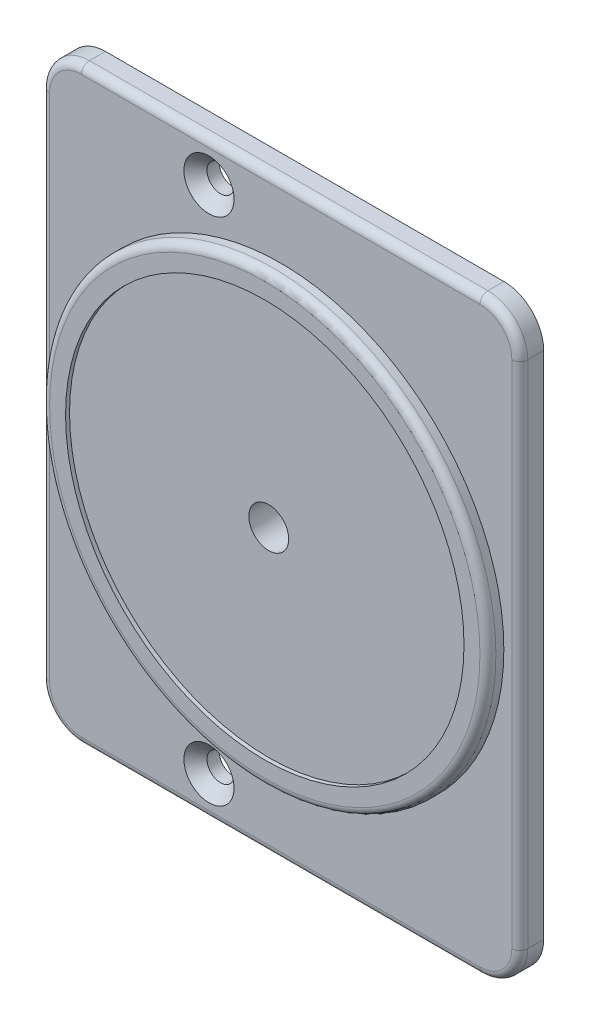
ISO-10303-21;
HEADER;
FILE_DESCRIPTION(('STEP AP214'),'2;1');
FILE_NAME('part.step','',(''),(''),'','','');
FILE_SCHEMA(('AUTOMOTIVE_DESIGN { 1 0 10303 214 1 1 1 1 }'));
ENDSEC;
DATA;
#1=APPLICATION_CONTEXT('core data for automotive mechanical design processes');
#2=APPLICATION_PROTOCOL_DEFINITION('international standard','automotive_design',2000,#1);
#3=PRODUCT_CONTEXT('',#1,'mechanical');
#4=PRODUCT('Part','Part','',(#3));
#5=PRODUCT_RELATED_PRODUCT_CATEGORY('part','',(#4));
#6=PRODUCT_DEFINITION_FORMATION('','',#4);
#7=PRODUCT_DEFINITION_CONTEXT('part definition',#1,'design');
#8=PRODUCT_DEFINITION('design','',#6,#7);
#9=PRODUCT_DEFINITION_SHAPE('','',#8);
#10=(LENGTH_UNIT() NAMED_UNIT(*) SI_UNIT(.MILLI.,.METRE.));
#11=(NAMED_UNIT(*) PLANE_ANGLE_UNIT() SI_UNIT($,.RADIAN.));
#12=(NAMED_UNIT(*) SI_UNIT($,.STERADIAN.) SOLID_ANGLE_UNIT());
#13=UNCERTAINTY_MEASURE_WITH_UNIT(LENGTH_MEASURE(1.E-05),#10,'distance_accuracy_value','');
#14=(GEOMETRIC_REPRESENTATION_CONTEXT(3) GLOBAL_UNCERTAINTY_ASSIGNED_CONTEXT((#13)) GLOBAL_UNIT_ASSIGNED_CONTEXT((#10,
#11,#12)) REPRESENTATION_CONTEXT('',''));
#15=CARTESIAN_POINT('',(0.,0.,0.));
#16=DIRECTION('',(0.,0.,1.));
#17=DIRECTION('',(1.,0.,0.));
#18=AXIS2_PLACEMENT_3D('',#15,#16,#17);
#19=CARTESIAN_POINT('',(0.,0.,0.));
#20=DIRECTION('',(0.,0.,1.));
#21=DIRECTION('',(1.,0.,0.));
#22=AXIS2_PLACEMENT_3D('',#19,#20,#21);
#23=PLANE('',#22);
#24=CARTESIAN_POINT('',(-9.,32.,0.));
#25=DIRECTION('',(0.,0.,1.));
#26=DIRECTION('',(1.,0.,0.));
#27=AXIS2_PLACEMENT_3D('',#24,#25,#26);
#28=CIRCLE('',#27,3.15);
#29=CARTESIAN_POINT('',(-5.85,32.,0.));
#30=VERTEX_POINT('',#29);
#31=EDGE_CURVE('E539',#30,#30,#28,.T.);
#32=ORIENTED_EDGE('',*,*,#31,.F.);
#33=EDGE_LOOP('',(#32));
#34=FACE_BOUND('',#33,.T.);
#35=CARTESIAN_POINT('',(-9.,-32.,0.));
#36=DIRECTION('',(0.,0.,1.));
#37=DIRECTION('',(1.,0.,0.));
#38=AXIS2_PLACEMENT_3D('',#35,#36,#37);
#39=CIRCLE('',#38,3.15);
#40=CARTESIAN_POINT('',(-5.85,-32.,0.));
#41=VERTEX_POINT('',#40);
#42=EDGE_CURVE('E546',#41,#41,#39,.T.);
#43=ORIENTED_EDGE('',*,*,#42,.F.);
#44=EDGE_LOOP('',(#43));
#45=FACE_BOUND('',#44,.T.);
#46=DIRECTION('',(0.,1.,0.));
#47=VECTOR('',#46,1.);
#48=CARTESIAN_POINT('',(29.,0.,0.));
#49=LINE('',#48,#47);
#50=CARTESIAN_POINT('',(29.,-32.,0.));
#51=VERTEX_POINT('',#50);
#52=CARTESIAN_POINT('',(29.,32.,0.));
#53=VERTEX_POINT('',#52);
#54=EDGE_CURVE('E181',#51,#53,#49,.T.);
#55=ORIENTED_EDGE('',*,*,#54,.T.);
#56=CARTESIAN_POINT('',(25.,32.,0.));
#57=DIRECTION('',(0.,0.,1.));
#58=DIRECTION('',(1.,0.,0.));
#59=AXIS2_PLACEMENT_3D('',#56,#57,#58);
#60=CIRCLE('',#59,4.);
#61=CARTESIAN_POINT('',(25.,36.,0.));
#62=VERTEX_POINT('',#61);
#63=EDGE_CURVE('E183',#53,#62,#60,.T.);
#64=ORIENTED_EDGE('',*,*,#63,.T.);
#65=DIRECTION('',(-1.,0.,0.));
#66=VECTOR('',#65,1.);
#67=CARTESIAN_POINT('',(0.,36.,0.));
#68=LINE('',#67,#66);
#69=CARTESIAN_POINT('',(-25.,36.,0.));
#70=VERTEX_POINT('',#69);
#71=EDGE_CURVE('E169',#62,#70,#68,.T.);
#72=ORIENTED_EDGE('',*,*,#71,.T.);
#73=CARTESIAN_POINT('',(-25.,32.,0.));
#74=DIRECTION('',(0.,0.,1.));
#75=DIRECTION('',(1.,0.,0.));
#76=AXIS2_PLACEMENT_3D('',#73,#74,#75);
#77=CIRCLE('',#76,4.);
#78=CARTESIAN_POINT('',(-29.,32.,0.));
#79=VERTEX_POINT('',#78);
#80=EDGE_CURVE('E171',#70,#79,#77,.T.);
#81=ORIENTED_EDGE('',*,*,#80,.T.);
#82=DIRECTION('',(0.,-1.,0.));
#83=VECTOR('',#82,1.);
#84=CARTESIAN_POINT('',(-29.,0.,0.));
#85=LINE('',#84,#83);
#86=CARTESIAN_POINT('',(-29.,-32.,0.));
#87=VERTEX_POINT('',#86);
#88=EDGE_CURVE('E173',#79,#87,#85,.T.);
#89=ORIENTED_EDGE('',*,*,#88,.T.);
#90=CARTESIAN_POINT('',(-25.,-32.,0.));
#91=DIRECTION('',(0.,0.,1.));
#92=DIRECTION('',(1.,0.,0.));
#93=AXIS2_PLACEMENT_3D('',#90,#91,#92);
#94=CIRCLE('',#93,4.);
#95=CARTESIAN_POINT('',(-25.,-36.,0.));
#96=VERTEX_POINT('',#95);
#97=EDGE_CURVE('E175',#87,#96,#94,.T.);
#98=ORIENTED_EDGE('',*,*,#97,.T.);
#99=DIRECTION('',(1.,0.,0.));
#100=VECTOR('',#99,1.);
#101=CARTESIAN_POINT('',(0.,-36.,0.));
#102=LINE('',#101,#100);
#103=CARTESIAN_POINT('',(25.,-36.,0.));
#104=VERTEX_POINT('',#103);
#105=EDGE_CURVE('E177',#96,#104,#102,.T.);
#106=ORIENTED_EDGE('',*,*,#105,.T.);
#107=CARTESIAN_POINT('',(25.,-32.,0.));
#108=DIRECTION('',(0.,0.,1.));
#109=DIRECTION('',(1.,0.,0.));
#110=AXIS2_PLACEMENT_3D('',#107,#108,#109);
#111=CIRCLE('',#110,4.);
#112=EDGE_CURVE('E179',#104,#51,#111,.T.);
#113=ORIENTED_EDGE('',*,*,#112,.T.);
#114=EDGE_LOOP('',(#55,#64,#72,#81,#89,#98,#106,#113));
#115=FACE_BOUND('',#114,.T.);
#116=CARTESIAN_POINT('',(0.,0.,0.));
#117=DIRECTION('',(0.,0.,1.));
#118=DIRECTION('',(1.,0.,0.));
#119=AXIS2_PLACEMENT_3D('',#116,#117,#118);
#120=CIRCLE('',#119,28.);
#121=CARTESIAN_POINT('',(28.,0.,0.));
#122=VERTEX_POINT('',#121);
#123=EDGE_CURVE('E233',#122,#122,#120,.T.);
#124=ORIENTED_EDGE('',*,*,#123,.F.);
#125=EDGE_LOOP('',(#124));
#126=FACE_BOUND('',#125,.T.);
#127=ADVANCED_FACE('F35',(#34,#45,#115,#126),#23,.T.);
#128=CARTESIAN_POINT('',(-30.,37.,-3.));
#129=DIRECTION('',(-1.,0.,0.));
#130=DIRECTION('',(0.,-1.,0.));
#131=AXIS2_PLACEMENT_3D('',#128,#129,#130);
#132=PLANE('',#131);
#133=DIRECTION('',(0.,0.,1.));
#134=VECTOR('',#133,1.);
#135=CARTESIAN_POINT('',(-30.,-32.,-3.));
#136=LINE('',#135,#134);
#137=CARTESIAN_POINT('',(-30.,-32.,-3.));
#138=VERTEX_POINT('',#137);
#139=CARTESIAN_POINT('',(-30.,-32.,-1.));
#140=VERTEX_POINT('',#139);
#141=EDGE_CURVE('E154',#138,#140,#136,.T.);
#142=ORIENTED_EDGE('',*,*,#141,.T.);
#143=DIRECTION('',(0.,-1.,0.));
#144=VECTOR('',#143,1.);
#145=CARTESIAN_POINT('',(-30.,37.,-1.));
#146=LINE('',#145,#144);
#147=CARTESIAN_POINT('',(-30.,32.,-1.));
#148=VERTEX_POINT('',#147);
#149=EDGE_CURVE('E60',#140,#148,#146,.F.);
#150=ORIENTED_EDGE('',*,*,#149,.T.);
#151=DIRECTION('',(0.,0.,1.));
#152=VECTOR('',#151,1.);
#153=CARTESIAN_POINT('',(-30.,32.,-3.));
#154=LINE('',#153,#152);
#155=CARTESIAN_POINT('',(-30.,32.,-3.));
#156=VERTEX_POINT('',#155);
#157=EDGE_CURVE('E157',#148,#156,#154,.F.);
#158=ORIENTED_EDGE('',*,*,#157,.T.);
#159=DIRECTION('',(0.,-1.,0.));
#160=VECTOR('',#159,1.);
#161=CARTESIAN_POINT('',(-30.,37.,-3.));
#162=LINE('',#161,#160);
#163=EDGE_CURVE('E150',#156,#138,#162,.T.);
#164=ORIENTED_EDGE('',*,*,#163,.T.);
#165=EDGE_LOOP('',(#142,#150,#158,#164));
#166=FACE_BOUND('',#165,.T.);
#167=ADVANCED_FACE('F272',(#166),#132,.T.);
#168=CARTESIAN_POINT('',(-30.,37.,-3.));
#169=DIRECTION('',(0.,1.,0.));
#170=DIRECTION('',(0.,0.,1.));
#171=AXIS2_PLACEMENT_3D('',#168,#169,#170);
#172=PLANE('',#171);
#173=DIRECTION('',(0.,0.,1.));
#174=VECTOR('',#173,1.);
#175=CARTESIAN_POINT('',(-25.,37.,-3.));
#176=LINE('',#175,#174);
#177=CARTESIAN_POINT('',(-25.,37.,-3.));
#178=VERTEX_POINT('',#177);
#179=CARTESIAN_POINT('',(-25.,37.,-1.));
#180=VERTEX_POINT('',#179);
#181=EDGE_CURVE('E165',#178,#180,#176,.T.);
#182=ORIENTED_EDGE('',*,*,#181,.T.);
#183=DIRECTION('',(-1.,0.,0.));
#184=VECTOR('',#183,1.);
#185=CARTESIAN_POINT('',(-30.,37.,-1.));
#186=LINE('',#185,#184);
#187=CARTESIAN_POINT('',(25.,37.,-1.));
#188=VERTEX_POINT('',#187);
#189=EDGE_CURVE('E11',#180,#188,#186,.F.);
#190=ORIENTED_EDGE('',*,*,#189,.T.);
#191=DIRECTION('',(0.,0.,1.));
#192=VECTOR('',#191,1.);
#193=CARTESIAN_POINT('',(25.,37.,-3.));
#194=LINE('',#193,#192);
#195=CARTESIAN_POINT('',(25.,37.,-3.));
#196=VERTEX_POINT('',#195);
#197=EDGE_CURVE('E167',#188,#196,#194,.F.);
#198=ORIENTED_EDGE('',*,*,#197,.T.);
#199=DIRECTION('',(-1.,0.,0.));
#200=VECTOR('',#199,1.);
#201=CARTESIAN_POINT('',(-30.,37.,-3.));
#202=LINE('',#201,#200);
#203=EDGE_CURVE('E139',#196,#178,#202,.T.);
#204=ORIENTED_EDGE('',*,*,#203,.T.);
#205=EDGE_LOOP('',(#182,#190,#198,#204));
#206=FACE_BOUND('',#205,.T.);
#207=ADVANCED_FACE('F253',(#206),#172,.T.);
#208=CARTESIAN_POINT('',(30.,37.,-3.));
#209=DIRECTION('',(1.,0.,0.));
#210=DIRECTION('',(0.,1.,0.));
#211=AXIS2_PLACEMENT_3D('',#208,#209,#210);
#212=PLANE('',#211);
#213=DIRECTION('',(0.,0.,1.));
#214=VECTOR('',#213,1.);
#215=CARTESIAN_POINT('',(30.,32.,-3.));
#216=LINE('',#215,#214);
#217=CARTESIAN_POINT('',(30.,32.,-3.));
#218=VERTEX_POINT('',#217);
#219=CARTESIAN_POINT('',(30.,32.,-1.));
#220=VERTEX_POINT('',#219);
#221=EDGE_CURVE('E245',#218,#220,#216,.T.);
#222=ORIENTED_EDGE('',*,*,#221,.T.);
#223=DIRECTION('',(0.,1.,0.));
#224=VECTOR('',#223,1.);
#225=CARTESIAN_POINT('',(30.,37.,-1.));
#226=LINE('',#225,#224);
#227=CARTESIAN_POINT('',(30.,-32.,-1.));
#228=VERTEX_POINT('',#227);
#229=EDGE_CURVE('E189',#220,#228,#226,.F.);
#230=ORIENTED_EDGE('',*,*,#229,.T.);
#231=DIRECTION('',(0.,0.,1.));
#232=VECTOR('',#231,1.);
#233=CARTESIAN_POINT('',(30.,-32.,-3.));
#234=LINE('',#233,#232);
#235=CARTESIAN_POINT('',(30.,-32.,-3.));
#236=VERTEX_POINT('',#235);
#237=EDGE_CURVE('E248',#228,#236,#234,.F.);
#238=ORIENTED_EDGE('',*,*,#237,.T.);
#239=DIRECTION('',(0.,1.,0.));
#240=VECTOR('',#239,1.);
#241=CARTESIAN_POINT('',(30.,37.,-3.));
#242=LINE('',#241,#240);
#243=EDGE_CURVE('E149',#236,#218,#242,.T.);
#244=ORIENTED_EDGE('',*,*,#243,.T.);
#245=EDGE_LOOP('',(#222,#230,#238,#244));
#246=FACE_BOUND('',#245,.T.);
#247=ADVANCED_FACE('F286',(#246),#212,.T.);
#248=CARTESIAN_POINT('',(-30.,-37.,-3.));
#249=DIRECTION('',(0.,-1.,0.));
#250=DIRECTION('',(0.,0.,-1.));
#251=AXIS2_PLACEMENT_3D('',#248,#249,#250);
#252=PLANE('',#251);
#253=DIRECTION('',(0.,0.,1.));
#254=VECTOR('',#253,1.);
#255=CARTESIAN_POINT('',(25.,-37.,-3.));
#256=LINE('',#255,#254);
#257=CARTESIAN_POINT('',(25.,-37.,-3.));
#258=VERTEX_POINT('',#257);
#259=CARTESIAN_POINT('',(25.,-37.,-1.));
#260=VERTEX_POINT('',#259);
#261=EDGE_CURVE('E138',#258,#260,#256,.T.);
#262=ORIENTED_EDGE('',*,*,#261,.T.);
#263=DIRECTION('',(1.,0.,0.));
#264=VECTOR('',#263,1.);
#265=CARTESIAN_POINT('',(-30.,-37.,-1.));
#266=LINE('',#265,#264);
#267=CARTESIAN_POINT('',(-25.,-37.,-1.));
#268=VERTEX_POINT('',#267);
#269=EDGE_CURVE('E134',#260,#268,#266,.F.);
#270=ORIENTED_EDGE('',*,*,#269,.T.);
#271=DIRECTION('',(0.,0.,1.));
#272=VECTOR('',#271,1.);
#273=CARTESIAN_POINT('',(-25.,-37.,-3.));
#274=LINE('',#273,#272);
#275=CARTESIAN_POINT('',(-25.,-37.,-3.));
#276=VERTEX_POINT('',#275);
#277=EDGE_CURVE('E127',#268,#276,#274,.F.);
#278=ORIENTED_EDGE('',*,*,#277,.T.);
#279=DIRECTION('',(1.,0.,0.));
#280=VECTOR('',#279,1.);
#281=CARTESIAN_POINT('',(-30.,-37.,-3.));
#282=LINE('',#281,#280);
#283=EDGE_CURVE('E131',#276,#258,#282,.T.);
#284=ORIENTED_EDGE('',*,*,#283,.T.);
#285=EDGE_LOOP('',(#262,#270,#278,#284));
#286=FACE_BOUND('',#285,.T.);
#287=ADVANCED_FACE('F130',(#286),#252,.T.);
#288=CARTESIAN_POINT('',(0.,0.,-3.));
#289=DIRECTION('',(0.,0.,1.));
#290=DIRECTION('',(1.,0.,0.));
#291=AXIS2_PLACEMENT_3D('',#288,#289,#290);
#292=PLANE('',#291);
#293=CARTESIAN_POINT('',(-9.,32.,-3.));
#294=DIRECTION('',(0.,0.,1.));
#295=DIRECTION('',(1.,0.,0.));
#296=AXIS2_PLACEMENT_3D('',#293,#294,#295);
#297=CIRCLE('',#296,1.7);
#298=CARTESIAN_POINT('',(-7.3,32.,-3.));
#299=VERTEX_POINT('',#298);
#300=EDGE_CURVE('E541',#299,#299,#297,.T.);
#301=ORIENTED_EDGE('',*,*,#300,.T.);
#302=EDGE_LOOP('',(#301));
#303=FACE_BOUND('',#302,.T.);
#304=CARTESIAN_POINT('',(-9.,-32.,-3.));
#305=DIRECTION('',(0.,0.,1.));
#306=DIRECTION('',(1.,0.,0.));
#307=AXIS2_PLACEMENT_3D('',#304,#305,#306);
#308=CIRCLE('',#307,1.7);
#309=CARTESIAN_POINT('',(-7.3,-32.,-3.));
#310=VERTEX_POINT('',#309);
#311=EDGE_CURVE('E552',#310,#310,#308,.T.);
#312=ORIENTED_EDGE('',*,*,#311,.T.);
#313=EDGE_LOOP('',(#312));
#314=FACE_BOUND('',#313,.T.);
#315=CARTESIAN_POINT('',(0.,0.,-3.));
#316=DIRECTION('',(0.,0.,-1.));
#317=DIRECTION('',(-1.,0.,0.));
#318=AXIS2_PLACEMENT_3D('',#315,#316,#317);
#319=CIRCLE('',#318,2.5);
#320=CARTESIAN_POINT('',(-2.5,0.,-3.));
#321=VERTEX_POINT('',#320);
#322=EDGE_CURVE('E554',#321,#321,#319,.T.);
#323=ORIENTED_EDGE('',*,*,#322,.F.);
#324=EDGE_LOOP('',(#323));
#325=FACE_BOUND('',#324,.T.);
#326=ORIENTED_EDGE('',*,*,#243,.F.);
#327=CARTESIAN_POINT('',(25.,-32.,-3.));
#328=DIRECTION('',(0.,0.,1.));
#329=DIRECTION('',(1.,0.,0.));
#330=AXIS2_PLACEMENT_3D('',#327,#328,#329);
#331=CIRCLE('',#330,5.);
#332=EDGE_CURVE('E148',#236,#258,#331,.F.);
#333=ORIENTED_EDGE('',*,*,#332,.T.);
#334=ORIENTED_EDGE('',*,*,#283,.F.);
#335=CARTESIAN_POINT('',(-25.,-32.,-3.));
#336=DIRECTION('',(0.,0.,1.));
#337=DIRECTION('',(1.,0.,0.));
#338=AXIS2_PLACEMENT_3D('',#335,#336,#337);
#339=CIRCLE('',#338,5.);
#340=EDGE_CURVE('E145',#276,#138,#339,.F.);
#341=ORIENTED_EDGE('',*,*,#340,.T.);
#342=ORIENTED_EDGE('',*,*,#163,.F.);
#343=CARTESIAN_POINT('',(-25.,32.,-3.));
#344=DIRECTION('',(0.,0.,1.));
#345=DIRECTION('',(1.,0.,0.));
#346=AXIS2_PLACEMENT_3D('',#343,#344,#345);
#347=CIRCLE('',#346,5.);
#348=EDGE_CURVE('E159',#156,#178,#347,.F.);
#349=ORIENTED_EDGE('',*,*,#348,.T.);
#350=ORIENTED_EDGE('',*,*,#203,.F.);
#351=CARTESIAN_POINT('',(25.,32.,-3.));
#352=DIRECTION('',(0.,0.,1.));
#353=DIRECTION('',(1.,0.,0.));
#354=AXIS2_PLACEMENT_3D('',#351,#352,#353);
#355=CIRCLE('',#354,5.);
#356=EDGE_CURVE('E155',#196,#218,#355,.F.);
#357=ORIENTED_EDGE('',*,*,#356,.T.);
#358=EDGE_LOOP('',(#326,#333,#334,#341,#342,#349,#350,#357));
#359=FACE_BOUND('',#358,.T.);
#360=ADVANCED_FACE('F143',(#303,#314,#325,#359),#292,.F.);
#361=CARTESIAN_POINT('',(0.,0.,2.));
#362=DIRECTION('',(0.,0.,-1.));
#363=DIRECTION('',(-1.,0.,0.));
#364=AXIS2_PLACEMENT_3D('',#361,#362,#363);
#365=CYLINDRICAL_SURFACE('',#364,28.);
#366=CARTESIAN_POINT('',(0.,0.,1.));
#367=DIRECTION('',(0.,0.,1.));
#368=DIRECTION('',(1.,0.,0.));
#369=AXIS2_PLACEMENT_3D('',#366,#367,#368);
#370=CIRCLE('',#369,28.);
#371=CARTESIAN_POINT('',(28.,0.,1.));
#372=VERTEX_POINT('',#371);
#373=EDGE_CURVE('E44',#372,#372,#370,.F.);
#374=ORIENTED_EDGE('',*,*,#373,.T.);
#375=EDGE_LOOP('',(#374));
#376=FACE_BOUND('',#375,.T.);
#377=ORIENTED_EDGE('',*,*,#123,.T.);
#378=EDGE_LOOP('',(#377));
#379=FACE_BOUND('',#378,.T.);
#380=ADVANCED_FACE('F431',(#376,#379),#365,.T.);
#381=CARTESIAN_POINT('',(0.,0.,2.));
#382=DIRECTION('',(0.,0.,1.));
#383=DIRECTION('',(1.,0.,0.));
#384=AXIS2_PLACEMENT_3D('',#381,#382,#383);
#385=PLANE('',#384);
#386=CARTESIAN_POINT('',(0.,0.,2.));
#387=DIRECTION('',(0.,0.,1.));
#388=DIRECTION('',(1.,0.,0.));
#389=AXIS2_PLACEMENT_3D('',#386,#387,#388);
#390=CIRCLE('',#389,27.);
#391=CARTESIAN_POINT('',(27.,0.,2.));
#392=VERTEX_POINT('',#391);
#393=EDGE_CURVE('E198',#392,#392,#390,.T.);
#394=ORIENTED_EDGE('',*,*,#393,.T.);
#395=EDGE_LOOP('',(#394));
#396=FACE_BOUND('',#395,.T.);
#397=CARTESIAN_POINT('',(0.,0.,2.));
#398=DIRECTION('',(0.,0.,1.));
#399=DIRECTION('',(1.,0.,0.));
#400=AXIS2_PLACEMENT_3D('',#397,#398,#399);
#401=CIRCLE('',#400,25.);
#402=CARTESIAN_POINT('',(25.,0.,2.));
#403=VERTEX_POINT('',#402);
#404=EDGE_CURVE('E223',#403,#403,#401,.T.);
#405=ORIENTED_EDGE('',*,*,#404,.F.);
#406=EDGE_LOOP('',(#405));
#407=FACE_BOUND('',#406,.T.);
#408=ADVANCED_FACE('F478',(#396,#407),#385,.T.);
#409=CARTESIAN_POINT('',(0.,0.,1.5));
#410=DIRECTION('',(0.,0.,1.));
#411=DIRECTION('',(1.,0.,0.));
#412=AXIS2_PLACEMENT_3D('',#409,#410,#411);
#413=CYLINDRICAL_SURFACE('',#412,25.);
#414=CARTESIAN_POINT('',(0.,0.,1.5));
#415=DIRECTION('',(0.,0.,1.));
#416=DIRECTION('',(1.,0.,0.));
#417=AXIS2_PLACEMENT_3D('',#414,#415,#416);
#418=CIRCLE('',#417,25.);
#419=CARTESIAN_POINT('',(25.,0.,1.5));
#420=VERTEX_POINT('',#419);
#421=EDGE_CURVE('E228',#420,#420,#418,.T.);
#422=ORIENTED_EDGE('',*,*,#421,.F.);
#423=EDGE_LOOP('',(#422));
#424=FACE_BOUND('',#423,.T.);
#425=ORIENTED_EDGE('',*,*,#404,.T.);
#426=EDGE_LOOP('',(#425));
#427=FACE_BOUND('',#426,.T.);
#428=ADVANCED_FACE('F403',(#424,#427),#413,.F.);
#429=CARTESIAN_POINT('',(0.,0.,1.5));
#430=DIRECTION('',(0.,0.,1.));
#431=DIRECTION('',(1.,0.,0.));
#432=AXIS2_PLACEMENT_3D('',#429,#430,#431);
#433=PLANE('',#432);
#434=CARTESIAN_POINT('',(0.,0.,1.5));
#435=DIRECTION('',(0.,0.,1.));
#436=DIRECTION('',(1.,0.,0.));
#437=AXIS2_PLACEMENT_3D('',#434,#435,#436);
#438=CIRCLE('',#437,2.5);
#439=CARTESIAN_POINT('',(2.5,0.,1.5));
#440=VERTEX_POINT('',#439);
#441=EDGE_CURVE('E39',#440,#440,#438,.T.);
#442=ORIENTED_EDGE('',*,*,#441,.F.);
#443=EDGE_LOOP('',(#442));
#444=FACE_BOUND('',#443,.T.);
#445=ORIENTED_EDGE('',*,*,#421,.T.);
#446=EDGE_LOOP('',(#445));
#447=FACE_BOUND('',#446,.T.);
#448=ADVANCED_FACE('F295',(#444,#447),#433,.T.);
#449=CARTESIAN_POINT('',(25.,-32.,-3.));
#450=DIRECTION('',(0.,0.,1.));
#451=DIRECTION('',(1.,0.,0.));
#452=AXIS2_PLACEMENT_3D('',#449,#450,#451);
#453=CYLINDRICAL_SURFACE('',#452,5.);
#454=ORIENTED_EDGE('',*,*,#237,.F.);
#455=CARTESIAN_POINT('',(25.,-32.,-1.));
#456=DIRECTION('',(0.,0.,1.));
#457=DIRECTION('',(1.,0.,0.));
#458=AXIS2_PLACEMENT_3D('',#455,#456,#457);
#459=CIRCLE('',#458,5.);
#460=EDGE_CURVE('E191',#228,#260,#459,.F.);
#461=ORIENTED_EDGE('',*,*,#460,.T.);
#462=ORIENTED_EDGE('',*,*,#261,.F.);
#463=ORIENTED_EDGE('',*,*,#332,.F.);
#464=EDGE_LOOP('',(#454,#461,#462,#463));
#465=FACE_BOUND('',#464,.T.);
#466=ADVANCED_FACE('F292',(#465),#453,.T.);
#467=CARTESIAN_POINT('',(-25.,-32.,-3.));
#468=DIRECTION('',(0.,0.,1.));
#469=DIRECTION('',(1.,0.,0.));
#470=AXIS2_PLACEMENT_3D('',#467,#468,#469);
#471=CYLINDRICAL_SURFACE('',#470,5.);
#472=ORIENTED_EDGE('',*,*,#277,.F.);
#473=CARTESIAN_POINT('',(-25.,-32.,-1.));
#474=DIRECTION('',(0.,0.,1.));
#475=DIRECTION('',(1.,0.,0.));
#476=AXIS2_PLACEMENT_3D('',#473,#474,#475);
#477=CIRCLE('',#476,5.);
#478=EDGE_CURVE('E194',#268,#140,#477,.F.);
#479=ORIENTED_EDGE('',*,*,#478,.T.);
#480=ORIENTED_EDGE('',*,*,#141,.F.);
#481=ORIENTED_EDGE('',*,*,#340,.F.);
#482=EDGE_LOOP('',(#472,#479,#480,#481));
#483=FACE_BOUND('',#482,.T.);
#484=ADVANCED_FACE('F153',(#483),#471,.T.);
#485=CARTESIAN_POINT('',(25.,32.,-3.));
#486=DIRECTION('',(0.,0.,1.));
#487=DIRECTION('',(1.,0.,0.));
#488=AXIS2_PLACEMENT_3D('',#485,#486,#487);
#489=CYLINDRICAL_SURFACE('',#488,5.);
#490=ORIENTED_EDGE('',*,*,#197,.F.);
#491=CARTESIAN_POINT('',(25.,32.,-1.));
#492=DIRECTION('',(0.,0.,1.));
#493=DIRECTION('',(1.,0.,0.));
#494=AXIS2_PLACEMENT_3D('',#491,#492,#493);
#495=CIRCLE('',#494,5.);
#496=EDGE_CURVE('E186',#188,#220,#495,.F.);
#497=ORIENTED_EDGE('',*,*,#496,.T.);
#498=ORIENTED_EDGE('',*,*,#221,.F.);
#499=ORIENTED_EDGE('',*,*,#356,.F.);
#500=EDGE_LOOP('',(#490,#497,#498,#499));
#501=FACE_BOUND('',#500,.T.);
#502=ADVANCED_FACE('F260',(#501),#489,.T.);
#503=CARTESIAN_POINT('',(-25.,32.,-3.));
#504=DIRECTION('',(0.,0.,1.));
#505=DIRECTION('',(1.,0.,0.));
#506=AXIS2_PLACEMENT_3D('',#503,#504,#505);
#507=CYLINDRICAL_SURFACE('',#506,5.);
#508=ORIENTED_EDGE('',*,*,#157,.F.);
#509=CARTESIAN_POINT('',(-25.,32.,-1.));
#510=DIRECTION('',(0.,0.,1.));
#511=DIRECTION('',(1.,0.,0.));
#512=AXIS2_PLACEMENT_3D('',#509,#510,#511);
#513=CIRCLE('',#512,5.);
#514=EDGE_CURVE('E52',#148,#180,#513,.F.);
#515=ORIENTED_EDGE('',*,*,#514,.T.);
#516=ORIENTED_EDGE('',*,*,#181,.F.);
#517=ORIENTED_EDGE('',*,*,#348,.F.);
#518=EDGE_LOOP('',(#508,#515,#516,#517));
#519=FACE_BOUND('',#518,.T.);
#520=ADVANCED_FACE('F256',(#519),#507,.T.);
#521=CARTESIAN_POINT('',(-25.,-32.,-1.));
#522=DIRECTION('',(0.,0.,1.));
#523=DIRECTION('',(1.,0.,0.));
#524=AXIS2_PLACEMENT_3D('',#521,#522,#523);
#525=TOROIDAL_SURFACE('',#524,4.,1.);
#526=CARTESIAN_POINT('',(-29.,-32.,-1.));
#527=DIRECTION('',(0.,1.,0.));
#528=DIRECTION('',(0.,0.,1.));
#529=AXIS2_PLACEMENT_3D('',#526,#527,#528);
#530=CIRCLE('',#529,1.);
#531=EDGE_CURVE('E219',#140,#87,#530,.T.);
#532=ORIENTED_EDGE('',*,*,#531,.F.);
#533=ORIENTED_EDGE('',*,*,#478,.F.);
#534=CARTESIAN_POINT('',(-25.,-36.,-1.));
#535=DIRECTION('',(1.,0.,0.));
#536=DIRECTION('',(0.,0.,-1.));
#537=AXIS2_PLACEMENT_3D('',#534,#535,#536);
#538=CIRCLE('',#537,1.);
#539=EDGE_CURVE('E221',#96,#268,#538,.T.);
#540=ORIENTED_EDGE('',*,*,#539,.F.);
#541=ORIENTED_EDGE('',*,*,#97,.F.);
#542=EDGE_LOOP('',(#532,#533,#540,#541));
#543=FACE_BOUND('',#542,.T.);
#544=ADVANCED_FACE('F259',(#543),#525,.T.);
#545=CARTESIAN_POINT('',(0.,-36.,-1.));
#546=DIRECTION('',(1.,0.,0.));
#547=DIRECTION('',(0.,0.,-1.));
#548=AXIS2_PLACEMENT_3D('',#545,#546,#547);
#549=CYLINDRICAL_SURFACE('',#548,1.);
#550=ORIENTED_EDGE('',*,*,#539,.T.);
#551=ORIENTED_EDGE('',*,*,#269,.F.);
#552=CARTESIAN_POINT('',(25.,-36.,-1.));
#553=DIRECTION('',(1.,0.,0.));
#554=DIRECTION('',(0.,0.,-1.));
#555=AXIS2_PLACEMENT_3D('',#552,#553,#554);
#556=CIRCLE('',#555,1.);
#557=EDGE_CURVE('E216',#104,#260,#556,.T.);
#558=ORIENTED_EDGE('',*,*,#557,.F.);
#559=ORIENTED_EDGE('',*,*,#105,.F.);
#560=EDGE_LOOP('',(#550,#551,#558,#559));
#561=FACE_BOUND('',#560,.T.);
#562=ADVANCED_FACE('F266',(#561),#549,.T.);
#563=CARTESIAN_POINT('',(-29.,0.,-1.));
#564=DIRECTION('',(0.,-1.,0.));
#565=DIRECTION('',(1.,0.,0.));
#566=AXIS2_PLACEMENT_3D('',#563,#564,#565);
#567=CYLINDRICAL_SURFACE('',#566,1.);
#568=ORIENTED_EDGE('',*,*,#531,.T.);
#569=ORIENTED_EDGE('',*,*,#88,.F.);
#570=CARTESIAN_POINT('',(-29.,32.,-1.));
#571=DIRECTION('',(0.,1.,0.));
#572=DIRECTION('',(0.,0.,1.));
#573=AXIS2_PLACEMENT_3D('',#570,#571,#572);
#574=CIRCLE('',#573,1.);
#575=EDGE_CURVE('E213',#148,#79,#574,.T.);
#576=ORIENTED_EDGE('',*,*,#575,.F.);
#577=ORIENTED_EDGE('',*,*,#149,.F.);
#578=EDGE_LOOP('',(#568,#569,#576,#577));
#579=FACE_BOUND('',#578,.T.);
#580=ADVANCED_FACE('F326',(#579),#567,.T.);
#581=CARTESIAN_POINT('',(25.,-32.,-1.));
#582=DIRECTION('',(0.,0.,1.));
#583=DIRECTION('',(1.,0.,0.));
#584=AXIS2_PLACEMENT_3D('',#581,#582,#583);
#585=TOROIDAL_SURFACE('',#584,4.,1.);
#586=ORIENTED_EDGE('',*,*,#557,.T.);
#587=ORIENTED_EDGE('',*,*,#460,.F.);
#588=CARTESIAN_POINT('',(29.,-32.,-1.));
#589=DIRECTION('',(0.,1.,0.));
#590=DIRECTION('',(0.,0.,1.));
#591=AXIS2_PLACEMENT_3D('',#588,#589,#590);
#592=CIRCLE('',#591,1.);
#593=EDGE_CURVE('E210',#51,#228,#592,.T.);
#594=ORIENTED_EDGE('',*,*,#593,.F.);
#595=ORIENTED_EDGE('',*,*,#112,.F.);
#596=EDGE_LOOP('',(#586,#587,#594,#595));
#597=FACE_BOUND('',#596,.T.);
#598=ADVANCED_FACE('F335',(#597),#585,.T.);
#599=CARTESIAN_POINT('',(-25.,32.,-1.));
#600=DIRECTION('',(0.,0.,1.));
#601=DIRECTION('',(1.,0.,0.));
#602=AXIS2_PLACEMENT_3D('',#599,#600,#601);
#603=TOROIDAL_SURFACE('',#602,4.,1.);
#604=ORIENTED_EDGE('',*,*,#575,.T.);
#605=ORIENTED_EDGE('',*,*,#80,.F.);
#606=CARTESIAN_POINT('',(-25.,36.,-1.));
#607=DIRECTION('',(1.,0.,0.));
#608=DIRECTION('',(0.,0.,-1.));
#609=AXIS2_PLACEMENT_3D('',#606,#607,#608);
#610=CIRCLE('',#609,1.);
#611=EDGE_CURVE('E207',#180,#70,#610,.T.);
#612=ORIENTED_EDGE('',*,*,#611,.F.);
#613=ORIENTED_EDGE('',*,*,#514,.F.);
#614=EDGE_LOOP('',(#604,#605,#612,#613));
#615=FACE_BOUND('',#614,.T.);
#616=ADVANCED_FACE('F345',(#615),#603,.T.);
#617=CARTESIAN_POINT('',(29.,0.,-1.));
#618=DIRECTION('',(0.,1.,0.));
#619=DIRECTION('',(-1.,0.,0.));
#620=AXIS2_PLACEMENT_3D('',#617,#618,#619);
#621=CYLINDRICAL_SURFACE('',#620,1.);
#622=ORIENTED_EDGE('',*,*,#593,.T.);
#623=ORIENTED_EDGE('',*,*,#229,.F.);
#624=CARTESIAN_POINT('',(29.,32.,-1.));
#625=DIRECTION('',(0.,1.,0.));
#626=DIRECTION('',(0.,0.,1.));
#627=AXIS2_PLACEMENT_3D('',#624,#625,#626);
#628=CIRCLE('',#627,1.);
#629=EDGE_CURVE('E205',#53,#220,#628,.T.);
#630=ORIENTED_EDGE('',*,*,#629,.F.);
#631=ORIENTED_EDGE('',*,*,#54,.F.);
#632=EDGE_LOOP('',(#622,#623,#630,#631));
#633=FACE_BOUND('',#632,.T.);
#634=ADVANCED_FACE('F355',(#633),#621,.T.);
#635=CARTESIAN_POINT('',(0.,36.,-1.));
#636=DIRECTION('',(-1.,0.,0.));
#637=DIRECTION('',(0.,0.,1.));
#638=AXIS2_PLACEMENT_3D('',#635,#636,#637);
#639=CYLINDRICAL_SURFACE('',#638,1.);
#640=ORIENTED_EDGE('',*,*,#611,.T.);
#641=ORIENTED_EDGE('',*,*,#71,.F.);
#642=CARTESIAN_POINT('',(25.,36.,-1.));
#643=DIRECTION('',(1.,0.,0.));
#644=DIRECTION('',(0.,0.,-1.));
#645=AXIS2_PLACEMENT_3D('',#642,#643,#644);
#646=CIRCLE('',#645,1.);
#647=EDGE_CURVE('E203',#188,#62,#646,.T.);
#648=ORIENTED_EDGE('',*,*,#647,.F.);
#649=ORIENTED_EDGE('',*,*,#189,.F.);
#650=EDGE_LOOP('',(#640,#641,#648,#649));
#651=FACE_BOUND('',#650,.T.);
#652=ADVANCED_FACE('F365',(#651),#639,.T.);
#653=CARTESIAN_POINT('',(25.,32.,-1.));
#654=DIRECTION('',(0.,0.,1.));
#655=DIRECTION('',(1.,0.,0.));
#656=AXIS2_PLACEMENT_3D('',#653,#654,#655);
#657=TOROIDAL_SURFACE('',#656,4.,1.);
#658=ORIENTED_EDGE('',*,*,#629,.T.);
#659=ORIENTED_EDGE('',*,*,#496,.F.);
#660=ORIENTED_EDGE('',*,*,#647,.T.);
#661=ORIENTED_EDGE('',*,*,#63,.F.);
#662=EDGE_LOOP('',(#658,#659,#660,#661));
#663=FACE_BOUND('',#662,.T.);
#664=ADVANCED_FACE('F375',(#663),#657,.T.);
#665=CARTESIAN_POINT('',(0.,0.,1.));
#666=DIRECTION('',(0.,0.,1.));
#667=DIRECTION('',(1.,0.,0.));
#668=AXIS2_PLACEMENT_3D('',#665,#666,#667);
#669=TOROIDAL_SURFACE('',#668,27.,1.);
#670=ORIENTED_EDGE('',*,*,#373,.F.);
#671=EDGE_LOOP('',(#670));
#672=FACE_BOUND('',#671,.T.);
#673=ORIENTED_EDGE('',*,*,#393,.F.);
#674=EDGE_LOOP('',(#673));
#675=FACE_BOUND('',#674,.T.);
#676=ADVANCED_FACE('F37',(#672,#675),#669,.T.);
#677=CARTESIAN_POINT('',(0.,0.,2.));
#678=DIRECTION('',(0.,0.,-1.));
#679=DIRECTION('',(-1.,0.,0.));
#680=AXIS2_PLACEMENT_3D('',#677,#678,#679);
#681=CYLINDRICAL_SURFACE('',#680,2.5);
#682=ORIENTED_EDGE('',*,*,#441,.T.);
#683=EDGE_LOOP('',(#682));
#684=FACE_BOUND('',#683,.T.);
#685=ORIENTED_EDGE('',*,*,#322,.T.);
#686=EDGE_LOOP('',(#685));
#687=FACE_BOUND('',#686,.T.);
#688=ADVANCED_FACE('F393',(#684,#687),#681,.F.);
#689=CARTESIAN_POINT('',(-9.,-32.,0.));
#690=DIRECTION('',(0.,0.,1.));
#691=DIRECTION('',(1.,0.,0.));
#692=AXIS2_PLACEMENT_3D('',#689,#690,#691);
#693=CYLINDRICAL_SURFACE('',#692,1.7);
#694=ORIENTED_EDGE('',*,*,#311,.F.);
#695=EDGE_LOOP('',(#694));
#696=FACE_BOUND('',#695,.T.);
#697=CARTESIAN_POINT('',(-9.,-32.,-1.45));
#698=DIRECTION('',(0.,0.,1.));
#699=DIRECTION('',(1.,0.,0.));
#700=AXIS2_PLACEMENT_3D('',#697,#698,#699);
#701=CIRCLE('',#700,1.7);
#702=CARTESIAN_POINT('',(-7.3,-32.,-1.45));
#703=VERTEX_POINT('',#702);
#704=EDGE_CURVE('E549',#703,#703,#701,.T.);
#705=ORIENTED_EDGE('',*,*,#704,.T.);
#706=EDGE_LOOP('',(#705));
#707=FACE_BOUND('',#706,.T.);
#708=ADVANCED_FACE('F413',(#696,#707),#693,.F.);
#709=CARTESIAN_POINT('',(-9.,-32.,0.));
#710=DIRECTION('',(0.,0.,1.));
#711=DIRECTION('',(1.,0.,0.));
#712=AXIS2_PLACEMENT_3D('',#709,#710,#711);
#713=CONICAL_SURFACE('',#712,3.15,0.785398163397448);
#714=ORIENTED_EDGE('',*,*,#704,.F.);
#715=EDGE_LOOP('',(#714));
#716=FACE_BOUND('',#715,.T.);
#717=ORIENTED_EDGE('',*,*,#42,.T.);
#718=EDGE_LOOP('',(#717));
#719=FACE_BOUND('',#718,.T.);
#720=ADVANCED_FACE('F440',(#716,#719),#713,.F.);
#721=CARTESIAN_POINT('',(-9.,32.,0.));
#722=DIRECTION('',(0.,0.,1.));
#723=DIRECTION('',(1.,0.,0.));
#724=AXIS2_PLACEMENT_3D('',#721,#722,#723);
#725=CYLINDRICAL_SURFACE('',#724,1.7);
#726=ORIENTED_EDGE('',*,*,#300,.F.);
#727=EDGE_LOOP('',(#726));
#728=FACE_BOUND('',#727,.T.);
#729=CARTESIAN_POINT('',(-9.,32.,-1.45));
#730=DIRECTION('',(0.,0.,1.));
#731=DIRECTION('',(1.,0.,0.));
#732=AXIS2_PLACEMENT_3D('',#729,#730,#731);
#733=CIRCLE('',#732,1.7);
#734=CARTESIAN_POINT('',(-7.3,32.,-1.45));
#735=VERTEX_POINT('',#734);
#736=EDGE_CURVE('E537',#735,#735,#733,.T.);
#737=ORIENTED_EDGE('',*,*,#736,.T.);
#738=EDGE_LOOP('',(#737));
#739=FACE_BOUND('',#738,.T.);
#740=ADVANCED_FACE('F450',(#728,#739),#725,.F.);
#741=CARTESIAN_POINT('',(-9.,32.,0.));
#742=DIRECTION('',(0.,0.,1.));
#743=DIRECTION('',(1.,0.,0.));
#744=AXIS2_PLACEMENT_3D('',#741,#742,#743);
#745=CONICAL_SURFACE('',#744,3.15,0.785398163397448);
#746=ORIENTED_EDGE('',*,*,#736,.F.);
#747=EDGE_LOOP('',(#746));
#748=FACE_BOUND('',#747,.T.);
#749=ORIENTED_EDGE('',*,*,#31,.T.);
#750=EDGE_LOOP('',(#749));
#751=FACE_BOUND('',#750,.T.);
#752=ADVANCED_FACE('F460',(#748,#751),#745,.F.);
#753=CLOSED_SHELL('',(#127,#167,#207,#247,#287,#360,#380,#408,#428,#448,#466,#484,#502,#520,
#544,#562,#580,#598,#616,#634,#652,#664,#676,#688,#708,#720,#740,#752));
#754=MANIFOLD_SOLID_BREP('B2',#753);
#755=ADVANCED_BREP_SHAPE_REPRESENTATION('',(#18,#754),#14);
#756=SHAPE_DEFINITION_REPRESENTATION(#9,#755);
ENDSEC;
END-ISO-10303-21;
